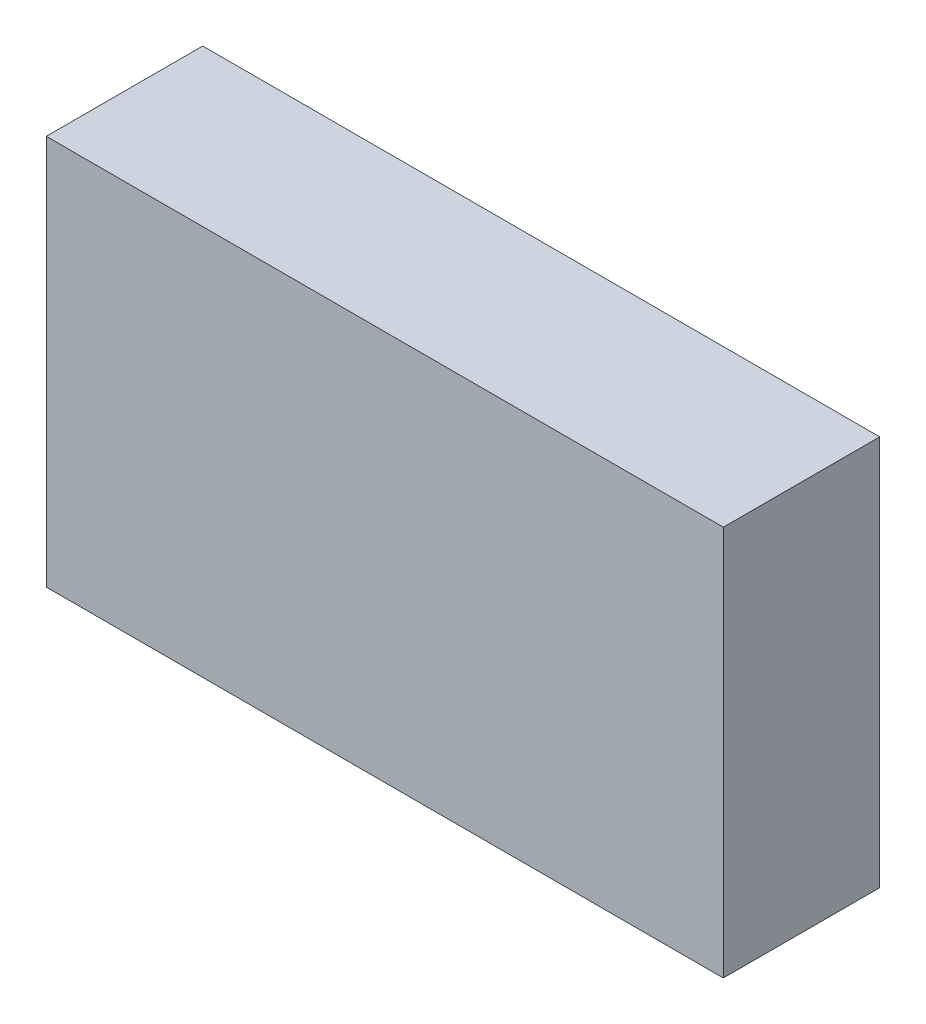
ISO-10303-21;
HEADER;
FILE_DESCRIPTION(('STEP AP214'),'2;1');
FILE_NAME('part.step','',(''),(''),'','','');
FILE_SCHEMA(('AUTOMOTIVE_DESIGN { 1 0 10303 214 1 1 1 1 }'));
ENDSEC;
DATA;
#1=APPLICATION_CONTEXT('core data for automotive mechanical design processes');
#2=APPLICATION_PROTOCOL_DEFINITION('international standard','automotive_design',2000,#1);
#3=PRODUCT_CONTEXT('',#1,'mechanical');
#4=PRODUCT('Part','Part','',(#3));
#5=PRODUCT_RELATED_PRODUCT_CATEGORY('part','',(#4));
#6=PRODUCT_DEFINITION_FORMATION('','',#4);
#7=PRODUCT_DEFINITION_CONTEXT('part definition',#1,'design');
#8=PRODUCT_DEFINITION('design','',#6,#7);
#9=PRODUCT_DEFINITION_SHAPE('','',#8);
#10=(LENGTH_UNIT() NAMED_UNIT(*) SI_UNIT(.MILLI.,.METRE.));
#11=(NAMED_UNIT(*) PLANE_ANGLE_UNIT() SI_UNIT($,.RADIAN.));
#12=(NAMED_UNIT(*) SI_UNIT($,.STERADIAN.) SOLID_ANGLE_UNIT());
#13=UNCERTAINTY_MEASURE_WITH_UNIT(LENGTH_MEASURE(1.E-05),#10,'distance_accuracy_value','');
#14=(GEOMETRIC_REPRESENTATION_CONTEXT(3) GLOBAL_UNCERTAINTY_ASSIGNED_CONTEXT((#13)) GLOBAL_UNIT_ASSIGNED_CONTEXT((#10,
#11,#12)) REPRESENTATION_CONTEXT('',''));
#15=CARTESIAN_POINT('',(0.,0.,0.));
#16=DIRECTION('',(0.,0.,1.));
#17=DIRECTION('',(1.,0.,0.));
#18=AXIS2_PLACEMENT_3D('',#15,#16,#17);
#19=CARTESIAN_POINT('',(29.0944217966884,1.,-20.0377370337011));
#20=DIRECTION('',(1.,0.,0.));
#21=DIRECTION('',(0.,0.,-1.));
#22=AXIS2_PLACEMENT_3D('',#19,#20,#21);
#23=PLANE('',#22);
#24=DIRECTION('',(0.,0.,1.));
#25=VECTOR('',#24,1.);
#26=CARTESIAN_POINT('',(29.0944217966884,0.,-20.0377370337011));
#27=LINE('',#26,#25);
#28=CARTESIAN_POINT('',(29.0944217966884,0.,-20.0377370337011));
#29=VERTEX_POINT('',#28);
#30=CARTESIAN_POINT('',(29.0944217966884,0.,-19.6371383605321));
#31=VERTEX_POINT('',#30);
#32=EDGE_CURVE('E11',#29,#31,#27,.T.);
#33=ORIENTED_EDGE('',*,*,#32,.T.);
#34=DIRECTION('',(0.,-1.,0.));
#35=VECTOR('',#34,1.);
#36=CARTESIAN_POINT('',(29.0944217966884,1.,-19.6371383605321));
#37=LINE('',#36,#35);
#38=CARTESIAN_POINT('',(29.0944217966884,1.,-19.6371383605321));
#39=VERTEX_POINT('',#38);
#40=EDGE_CURVE('E110',#39,#31,#37,.T.);
#41=ORIENTED_EDGE('',*,*,#40,.F.);
#42=DIRECTION('',(0.,0.,1.));
#43=VECTOR('',#42,1.);
#44=CARTESIAN_POINT('',(29.0944217966884,1.,-20.0377370337011));
#45=LINE('',#44,#43);
#46=CARTESIAN_POINT('',(29.0944217966884,1.,-20.0377370337011));
#47=VERTEX_POINT('',#46);
#48=EDGE_CURVE('E43',#47,#39,#45,.T.);
#49=ORIENTED_EDGE('',*,*,#48,.F.);
#50=DIRECTION('',(0.,-1.,0.));
#51=VECTOR('',#50,1.);
#52=CARTESIAN_POINT('',(29.0944217966884,1.,-20.0377370337011));
#53=LINE('',#52,#51);
#54=EDGE_CURVE('E83',#47,#29,#53,.T.);
#55=ORIENTED_EDGE('',*,*,#54,.T.);
#56=EDGE_LOOP('',(#33,#41,#49,#55));
#57=FACE_BOUND('',#56,.T.);
#58=ADVANCED_FACE('F39',(#57),#23,.F.);
#59=CARTESIAN_POINT('',(29.0944217966884,1.,-19.6371383605321));
#60=DIRECTION('',(0.,0.,-1.));
#61=DIRECTION('',(-1.,0.,0.));
#62=AXIS2_PLACEMENT_3D('',#59,#60,#61);
#63=PLANE('',#62);
#64=DIRECTION('',(1.,0.,0.));
#65=VECTOR('',#64,1.);
#66=CARTESIAN_POINT('',(29.0944217966884,0.,-19.6371383605321));
#67=LINE('',#66,#65);
#68=CARTESIAN_POINT('',(30.8285069487563,0.,-19.6371383605321));
#69=VERTEX_POINT('',#68);
#70=EDGE_CURVE('E49',#31,#69,#67,.T.);
#71=ORIENTED_EDGE('',*,*,#70,.T.);
#72=DIRECTION('',(0.,-1.,0.));
#73=VECTOR('',#72,1.);
#74=CARTESIAN_POINT('',(30.8285069487563,1.,-19.6371383605321));
#75=LINE('',#74,#73);
#76=CARTESIAN_POINT('',(30.8285069487563,1.,-19.6371383605321));
#77=VERTEX_POINT('',#76);
#78=EDGE_CURVE('E97',#77,#69,#75,.T.);
#79=ORIENTED_EDGE('',*,*,#78,.F.);
#80=DIRECTION('',(1.,0.,0.));
#81=VECTOR('',#80,1.);
#82=CARTESIAN_POINT('',(29.0944217966884,1.,-19.6371383605321));
#83=LINE('',#82,#81);
#84=EDGE_CURVE('E75',#39,#77,#83,.T.);
#85=ORIENTED_EDGE('',*,*,#84,.F.);
#86=ORIENTED_EDGE('',*,*,#40,.T.);
#87=EDGE_LOOP('',(#71,#79,#85,#86));
#88=FACE_BOUND('',#87,.T.);
#89=ADVANCED_FACE('F113',(#88),#63,.F.);
#90=CARTESIAN_POINT('',(30.8285069487563,1.,-20.0377370337011));
#91=DIRECTION('',(1.,0.,0.));
#92=DIRECTION('',(0.,0.,-1.));
#93=AXIS2_PLACEMENT_3D('',#90,#91,#92);
#94=PLANE('',#93);
#95=DIRECTION('',(0.,0.,1.));
#96=VECTOR('',#95,1.);
#97=CARTESIAN_POINT('',(30.8285069487563,0.,-20.0377370337011));
#98=LINE('',#97,#96);
#99=CARTESIAN_POINT('',(30.8285069487563,0.,-20.0377370337011));
#100=VERTEX_POINT('',#99);
#101=EDGE_CURVE('E99',#100,#69,#98,.T.);
#102=ORIENTED_EDGE('',*,*,#101,.F.);
#103=DIRECTION('',(0.,-1.,0.));
#104=VECTOR('',#103,1.);
#105=CARTESIAN_POINT('',(30.8285069487563,1.,-20.0377370337011));
#106=LINE('',#105,#104);
#107=CARTESIAN_POINT('',(30.8285069487563,1.,-20.0377370337011));
#108=VERTEX_POINT('',#107);
#109=EDGE_CURVE('E88',#108,#100,#106,.T.);
#110=ORIENTED_EDGE('',*,*,#109,.F.);
#111=DIRECTION('',(0.,0.,1.));
#112=VECTOR('',#111,1.);
#113=CARTESIAN_POINT('',(30.8285069487563,1.,-20.0377370337011));
#114=LINE('',#113,#112);
#115=EDGE_CURVE('E108',#108,#77,#114,.T.);
#116=ORIENTED_EDGE('',*,*,#115,.T.);
#117=ORIENTED_EDGE('',*,*,#78,.T.);
#118=EDGE_LOOP('',(#102,#110,#116,#117));
#119=FACE_BOUND('',#118,.T.);
#120=ADVANCED_FACE('F100',(#119),#94,.T.);
#121=CARTESIAN_POINT('',(29.0944217966884,1.,-20.0377370337011));
#122=DIRECTION('',(0.,0.,-1.));
#123=DIRECTION('',(-1.,0.,0.));
#124=AXIS2_PLACEMENT_3D('',#121,#122,#123);
#125=PLANE('',#124);
#126=DIRECTION('',(1.,0.,0.));
#127=VECTOR('',#126,1.);
#128=CARTESIAN_POINT('',(29.0944217966884,0.,-20.0377370337011));
#129=LINE('',#128,#127);
#130=EDGE_CURVE('E92',#29,#100,#129,.T.);
#131=ORIENTED_EDGE('',*,*,#130,.F.);
#132=ORIENTED_EDGE('',*,*,#54,.F.);
#133=DIRECTION('',(1.,0.,0.));
#134=VECTOR('',#133,1.);
#135=CARTESIAN_POINT('',(29.0944217966884,1.,-20.0377370337011));
#136=LINE('',#135,#134);
#137=EDGE_CURVE('E94',#47,#108,#136,.T.);
#138=ORIENTED_EDGE('',*,*,#137,.T.);
#139=ORIENTED_EDGE('',*,*,#109,.T.);
#140=EDGE_LOOP('',(#131,#132,#138,#139));
#141=FACE_BOUND('',#140,.T.);
#142=ADVANCED_FACE('F90',(#141),#125,.T.);
#143=CARTESIAN_POINT('',(0.,1.,0.));
#144=DIRECTION('',(0.,1.,0.));
#145=DIRECTION('',(0.,0.,1.));
#146=AXIS2_PLACEMENT_3D('',#143,#144,#145);
#147=PLANE('',#146);
#148=ORIENTED_EDGE('',*,*,#48,.T.);
#149=ORIENTED_EDGE('',*,*,#84,.T.);
#150=ORIENTED_EDGE('',*,*,#115,.F.);
#151=ORIENTED_EDGE('',*,*,#137,.F.);
#152=EDGE_LOOP('',(#148,#149,#150,#151));
#153=FACE_BOUND('',#152,.T.);
#154=ADVANCED_FACE('F41',(#153),#147,.T.);
#155=CARTESIAN_POINT('',(0.,0.,0.));
#156=DIRECTION('',(0.,1.,0.));
#157=DIRECTION('',(0.,0.,1.));
#158=AXIS2_PLACEMENT_3D('',#155,#156,#157);
#159=PLANE('',#158);
#160=ORIENTED_EDGE('',*,*,#32,.F.);
#161=ORIENTED_EDGE('',*,*,#130,.T.);
#162=ORIENTED_EDGE('',*,*,#101,.T.);
#163=ORIENTED_EDGE('',*,*,#70,.F.);
#164=EDGE_LOOP('',(#160,#161,#162,#163));
#165=FACE_BOUND('',#164,.T.);
#166=ADVANCED_FACE('F102',(#165),#159,.F.);
#167=CLOSED_SHELL('',(#58,#89,#120,#142,#154,#166));
#168=MANIFOLD_SOLID_BREP('B2',#167);
#169=ADVANCED_BREP_SHAPE_REPRESENTATION('',(#18,#168),#14);
#170=SHAPE_DEFINITION_REPRESENTATION(#9,#169);
ENDSEC;
END-ISO-10303-21;
